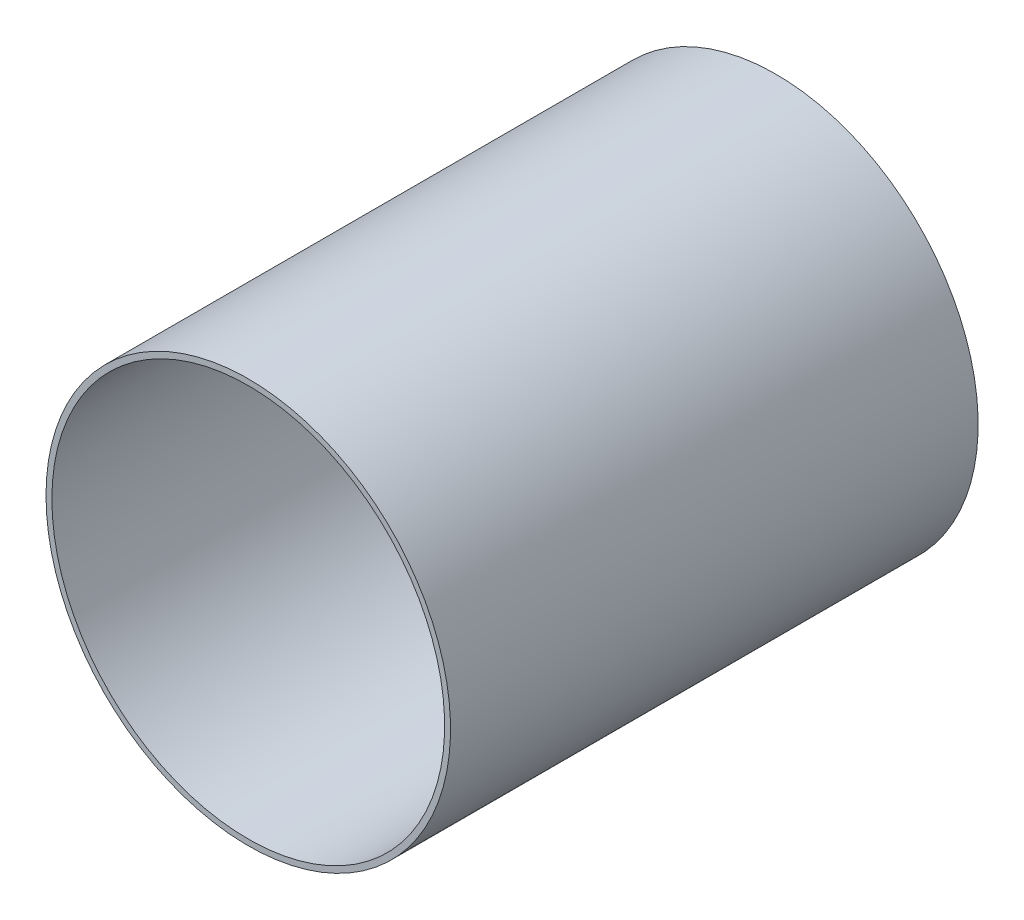
ISO-10303-21;
HEADER;
FILE_DESCRIPTION(('STEP AP214'),'2;1');
FILE_NAME('part.step','',(''),(''),'','','');
FILE_SCHEMA(('AUTOMOTIVE_DESIGN { 1 0 10303 214 1 1 1 1 }'));
ENDSEC;
DATA;
#1=APPLICATION_CONTEXT('core data for automotive mechanical design processes');
#2=APPLICATION_PROTOCOL_DEFINITION('international standard','automotive_design',2000,#1);
#3=PRODUCT_CONTEXT('',#1,'mechanical');
#4=PRODUCT('Part','Part','',(#3));
#5=PRODUCT_RELATED_PRODUCT_CATEGORY('part','',(#4));
#6=PRODUCT_DEFINITION_FORMATION('','',#4);
#7=PRODUCT_DEFINITION_CONTEXT('part definition',#1,'design');
#8=PRODUCT_DEFINITION('design','',#6,#7);
#9=PRODUCT_DEFINITION_SHAPE('','',#8);
#10=(LENGTH_UNIT() NAMED_UNIT(*) SI_UNIT(.MILLI.,.METRE.));
#11=(NAMED_UNIT(*) PLANE_ANGLE_UNIT() SI_UNIT($,.RADIAN.));
#12=(NAMED_UNIT(*) SI_UNIT($,.STERADIAN.) SOLID_ANGLE_UNIT());
#13=UNCERTAINTY_MEASURE_WITH_UNIT(LENGTH_MEASURE(1.E-05),#10,'distance_accuracy_value','');
#14=(GEOMETRIC_REPRESENTATION_CONTEXT(3) GLOBAL_UNCERTAINTY_ASSIGNED_CONTEXT((#13)) GLOBAL_UNIT_ASSIGNED_CONTEXT((#10,
#11,#12)) REPRESENTATION_CONTEXT('',''));
#15=CARTESIAN_POINT('',(0.,0.,0.));
#16=DIRECTION('',(0.,0.,1.));
#17=DIRECTION('',(1.,0.,0.));
#18=AXIS2_PLACEMENT_3D('',#15,#16,#17);
#19=CARTESIAN_POINT('',(0.,0.,90.));
#20=DIRECTION('',(0.,0.,1.));
#21=DIRECTION('',(1.,0.,0.));
#22=AXIS2_PLACEMENT_3D('',#19,#20,#21);
#23=PLANE('',#22);
#24=CARTESIAN_POINT('',(0.,0.,90.));
#25=DIRECTION('',(0.,0.,1.));
#26=DIRECTION('',(1.,0.,0.));
#27=AXIS2_PLACEMENT_3D('',#24,#25,#26);
#28=CIRCLE('',#27,34.5);
#29=CARTESIAN_POINT('',(-34.5,0.,90.));
#30=VERTEX_POINT('',#29);
#31=EDGE_CURVE('E11',#30,#30,#28,.T.);
#32=ORIENTED_EDGE('',*,*,#31,.T.);
#33=EDGE_LOOP('',(#32));
#34=FACE_BOUND('',#33,.T.);
#35=CARTESIAN_POINT('',(0.,0.,90.));
#36=DIRECTION('',(0.,0.,1.));
#37=DIRECTION('',(1.,0.,0.));
#38=AXIS2_PLACEMENT_3D('',#35,#36,#37);
#39=CIRCLE('',#38,33.5);
#40=CARTESIAN_POINT('',(-33.5,0.,90.));
#41=VERTEX_POINT('',#40);
#42=EDGE_CURVE('E54',#41,#41,#39,.T.);
#43=ORIENTED_EDGE('',*,*,#42,.F.);
#44=EDGE_LOOP('',(#43));
#45=FACE_BOUND('',#44,.T.);
#46=ADVANCED_FACE('F43',(#34,#45),#23,.T.);
#47=CARTESIAN_POINT('',(0.,0.,0.));
#48=DIRECTION('',(0.,0.,1.));
#49=DIRECTION('',(1.,0.,0.));
#50=AXIS2_PLACEMENT_3D('',#47,#48,#49);
#51=PLANE('',#50);
#52=CARTESIAN_POINT('',(0.,0.,0.));
#53=DIRECTION('',(0.,0.,1.));
#54=DIRECTION('',(1.,0.,0.));
#55=AXIS2_PLACEMENT_3D('',#52,#53,#54);
#56=CIRCLE('',#55,34.5);
#57=CARTESIAN_POINT('',(-34.5,0.,0.));
#58=VERTEX_POINT('',#57);
#59=EDGE_CURVE('E47',#58,#58,#56,.T.);
#60=ORIENTED_EDGE('',*,*,#59,.F.);
#61=EDGE_LOOP('',(#60));
#62=FACE_BOUND('',#61,.T.);
#63=CARTESIAN_POINT('',(0.,0.,0.));
#64=DIRECTION('',(0.,0.,1.));
#65=DIRECTION('',(1.,0.,0.));
#66=AXIS2_PLACEMENT_3D('',#63,#64,#65);
#67=CIRCLE('',#66,33.5);
#68=CARTESIAN_POINT('',(-33.5,0.,0.));
#69=VERTEX_POINT('',#68);
#70=EDGE_CURVE('E56',#69,#69,#67,.T.);
#71=ORIENTED_EDGE('',*,*,#70,.T.);
#72=EDGE_LOOP('',(#71));
#73=FACE_BOUND('',#72,.T.);
#74=ADVANCED_FACE('F66',(#62,#73),#51,.F.);
#75=CARTESIAN_POINT('',(0.,0.,90.));
#76=DIRECTION('',(0.,0.,-1.));
#77=DIRECTION('',(-1.,0.,0.));
#78=AXIS2_PLACEMENT_3D('',#75,#76,#77);
#79=CYLINDRICAL_SURFACE('',#78,34.5);
#80=CARTESIAN_POINT('',(-34.5,0.,90.));
#81=CARTESIAN_POINT('',(-34.5,0.,89.0625));
#82=CARTESIAN_POINT('',(-34.5,0.,88.125));
#83=CARTESIAN_POINT('',(-34.5,0.,86.25));
#84=CARTESIAN_POINT('',(-34.5,0.,85.3125));
#85=CARTESIAN_POINT('',(-34.5,0.,83.4375));
#86=CARTESIAN_POINT('',(-34.5,0.,82.5));
#87=CARTESIAN_POINT('',(-34.5,0.,80.625));
#88=CARTESIAN_POINT('',(-34.5,0.,79.6875));
#89=CARTESIAN_POINT('',(-34.5,0.,77.8125));
#90=CARTESIAN_POINT('',(-34.5,0.,76.875));
#91=CARTESIAN_POINT('',(-34.5,0.,75.));
#92=CARTESIAN_POINT('',(-34.5,0.,74.0625));
#93=CARTESIAN_POINT('',(-34.5,0.,72.1875));
#94=CARTESIAN_POINT('',(-34.5,0.,71.25));
#95=CARTESIAN_POINT('',(-34.5,0.,69.375));
#96=CARTESIAN_POINT('',(-34.5,0.,68.4375));
#97=CARTESIAN_POINT('',(-34.5,0.,66.5625));
#98=CARTESIAN_POINT('',(-34.5,0.,65.625));
#99=CARTESIAN_POINT('',(-34.5,0.,63.75));
#100=CARTESIAN_POINT('',(-34.5,0.,62.8125));
#101=CARTESIAN_POINT('',(-34.5,0.,60.9375));
#102=CARTESIAN_POINT('',(-34.5,0.,60.));
#103=CARTESIAN_POINT('',(-34.5,0.,58.125));
#104=CARTESIAN_POINT('',(-34.5,0.,57.1875));
#105=CARTESIAN_POINT('',(-34.5,0.,55.3125));
#106=CARTESIAN_POINT('',(-34.5,0.,54.375));
#107=CARTESIAN_POINT('',(-34.5,0.,52.5));
#108=CARTESIAN_POINT('',(-34.5,0.,51.5625));
#109=CARTESIAN_POINT('',(-34.5,0.,49.6875));
#110=CARTESIAN_POINT('',(-34.5,0.,48.75));
#111=CARTESIAN_POINT('',(-34.5,0.,46.875));
#112=CARTESIAN_POINT('',(-34.5,0.,45.9375));
#113=CARTESIAN_POINT('',(-34.5,0.,44.0625));
#114=CARTESIAN_POINT('',(-34.5,0.,43.125));
#115=CARTESIAN_POINT('',(-34.5,0.,41.25));
#116=CARTESIAN_POINT('',(-34.5,0.,40.3125));
#117=CARTESIAN_POINT('',(-34.5,0.,38.4375));
#118=CARTESIAN_POINT('',(-34.5,0.,37.5));
#119=CARTESIAN_POINT('',(-34.5,0.,35.625));
#120=CARTESIAN_POINT('',(-34.5,0.,34.6875));
#121=CARTESIAN_POINT('',(-34.5,0.,32.8125));
#122=CARTESIAN_POINT('',(-34.5,0.,31.875));
#123=CARTESIAN_POINT('',(-34.5,0.,30.));
#124=CARTESIAN_POINT('',(-34.5,0.,29.0625));
#125=CARTESIAN_POINT('',(-34.5,0.,27.1875));
#126=CARTESIAN_POINT('',(-34.5,0.,26.25));
#127=CARTESIAN_POINT('',(-34.5,0.,24.375));
#128=CARTESIAN_POINT('',(-34.5,0.,23.4375));
#129=CARTESIAN_POINT('',(-34.5,0.,21.5625));
#130=CARTESIAN_POINT('',(-34.5,0.,20.625));
#131=CARTESIAN_POINT('',(-34.5,0.,18.75));
#132=CARTESIAN_POINT('',(-34.5,0.,17.8125));
#133=CARTESIAN_POINT('',(-34.5,0.,15.9375));
#134=CARTESIAN_POINT('',(-34.5,0.,15.));
#135=CARTESIAN_POINT('',(-34.5,0.,13.125));
#136=CARTESIAN_POINT('',(-34.5,0.,12.1875));
#137=CARTESIAN_POINT('',(-34.5,0.,10.3125));
#138=CARTESIAN_POINT('',(-34.5,0.,9.37499999999999));
#139=CARTESIAN_POINT('',(-34.5,0.,7.49999999999999));
#140=CARTESIAN_POINT('',(-34.5,0.,6.56249999999999));
#141=CARTESIAN_POINT('',(-34.5,0.,4.68749999999999));
#142=CARTESIAN_POINT('',(-34.5,0.,3.74999999999998));
#143=CARTESIAN_POINT('',(-34.5,0.,1.87499999999998));
#144=CARTESIAN_POINT('',(-34.5,0.,0.937499999999986));
#145=CARTESIAN_POINT('',(-34.5,0.,0.));
#146=B_SPLINE_CURVE_WITH_KNOTS('',3,(#80,#81,#82,#83,#84,#85,#86,#87,#88,#89,#90,#91,#92,#93,
#94,#95,#96,#97,#98,#99,#100,#101,#102,#103,#104,#105,#106,#107,#108,#109,#110,#111,#112,#113,
#114,#115,#116,#117,#118,#119,#120,#121,#122,#123,#124,#125,#126,#127,#128,#129,#130,#131,#132,
#133,#134,#135,#136,#137,#138,#139,#140,#141,#142,#143,#144,#145),.UNSPECIFIED.,.F.,.F.,(4,2,2,
2,2,2,2,2,2,2,2,2,2,2,2,2,2,2,2,2,2,2,2,2,2,2,2,2,2,2,2,2,4),(0.,2.81250000000001,
5.62500000000001,8.43750000000001,11.25,14.0625,16.875,19.6875,22.5,25.3125,28.125,30.9375,
33.75,36.5625,39.375,42.1875,45.,47.8125,50.625,53.4375,56.25,59.0625,61.875,64.6875,67.5,
70.3125,73.125,75.9375,78.75,81.5625,84.375,87.1875,90.),.UNSPECIFIED.);
#147=EDGE_CURVE('BSEAM45',#30,#58,#146,.T.);
#148=ORIENTED_EDGE('',*,*,#31,.F.);
#149=ORIENTED_EDGE('',*,*,#59,.T.);
#150=ORIENTED_EDGE('',*,*,#147,.T.);
#151=ORIENTED_EDGE('',*,*,#147,.F.);
#152=EDGE_LOOP('',(#148,#150,#149,#151));
#153=FACE_BOUND('',#152,.T.);
#154=ADVANCED_FACE('F45',(#153),#79,.T.);
#155=CARTESIAN_POINT('',(0.,0.,90.));
#156=DIRECTION('',(0.,0.,-1.));
#157=DIRECTION('',(-1.,0.,0.));
#158=AXIS2_PLACEMENT_3D('',#155,#156,#157);
#159=CYLINDRICAL_SURFACE('',#158,33.5);
#160=CARTESIAN_POINT('',(-33.5,0.,90.));
#161=CARTESIAN_POINT('',(-33.5,0.,89.0625));
#162=CARTESIAN_POINT('',(-33.5,0.,88.125));
#163=CARTESIAN_POINT('',(-33.5,0.,86.25));
#164=CARTESIAN_POINT('',(-33.5,0.,85.3125));
#165=CARTESIAN_POINT('',(-33.5,0.,83.4375));
#166=CARTESIAN_POINT('',(-33.5,0.,82.5));
#167=CARTESIAN_POINT('',(-33.5,0.,80.625));
#168=CARTESIAN_POINT('',(-33.5,0.,79.6875));
#169=CARTESIAN_POINT('',(-33.5,0.,77.8125));
#170=CARTESIAN_POINT('',(-33.5,0.,76.875));
#171=CARTESIAN_POINT('',(-33.5,0.,75.));
#172=CARTESIAN_POINT('',(-33.5,0.,74.0625));
#173=CARTESIAN_POINT('',(-33.5,0.,72.1875));
#174=CARTESIAN_POINT('',(-33.5,0.,71.25));
#175=CARTESIAN_POINT('',(-33.5,0.,69.375));
#176=CARTESIAN_POINT('',(-33.5,0.,68.4375));
#177=CARTESIAN_POINT('',(-33.5,0.,66.5625));
#178=CARTESIAN_POINT('',(-33.5,0.,65.625));
#179=CARTESIAN_POINT('',(-33.5,0.,63.75));
#180=CARTESIAN_POINT('',(-33.5,0.,62.8125));
#181=CARTESIAN_POINT('',(-33.5,0.,60.9375));
#182=CARTESIAN_POINT('',(-33.5,0.,60.));
#183=CARTESIAN_POINT('',(-33.5,0.,58.125));
#184=CARTESIAN_POINT('',(-33.5,0.,57.1875));
#185=CARTESIAN_POINT('',(-33.5,0.,55.3125));
#186=CARTESIAN_POINT('',(-33.5,0.,54.375));
#187=CARTESIAN_POINT('',(-33.5,0.,52.5));
#188=CARTESIAN_POINT('',(-33.5,0.,51.5625));
#189=CARTESIAN_POINT('',(-33.5,0.,49.6875));
#190=CARTESIAN_POINT('',(-33.5,0.,48.75));
#191=CARTESIAN_POINT('',(-33.5,0.,46.875));
#192=CARTESIAN_POINT('',(-33.5,0.,45.9375));
#193=CARTESIAN_POINT('',(-33.5,0.,44.0625));
#194=CARTESIAN_POINT('',(-33.5,0.,43.125));
#195=CARTESIAN_POINT('',(-33.5,0.,41.25));
#196=CARTESIAN_POINT('',(-33.5,0.,40.3125));
#197=CARTESIAN_POINT('',(-33.5,0.,38.4375));
#198=CARTESIAN_POINT('',(-33.5,0.,37.5));
#199=CARTESIAN_POINT('',(-33.5,0.,35.625));
#200=CARTESIAN_POINT('',(-33.5,0.,34.6875));
#201=CARTESIAN_POINT('',(-33.5,0.,32.8125));
#202=CARTESIAN_POINT('',(-33.5,0.,31.875));
#203=CARTESIAN_POINT('',(-33.5,0.,30.));
#204=CARTESIAN_POINT('',(-33.5,0.,29.0625));
#205=CARTESIAN_POINT('',(-33.5,0.,27.1875));
#206=CARTESIAN_POINT('',(-33.5,0.,26.25));
#207=CARTESIAN_POINT('',(-33.5,0.,24.375));
#208=CARTESIAN_POINT('',(-33.5,0.,23.4375));
#209=CARTESIAN_POINT('',(-33.5,0.,21.5625));
#210=CARTESIAN_POINT('',(-33.5,0.,20.625));
#211=CARTESIAN_POINT('',(-33.5,0.,18.75));
#212=CARTESIAN_POINT('',(-33.5,0.,17.8125));
#213=CARTESIAN_POINT('',(-33.5,0.,15.9375));
#214=CARTESIAN_POINT('',(-33.5,0.,15.));
#215=CARTESIAN_POINT('',(-33.5,0.,13.125));
#216=CARTESIAN_POINT('',(-33.5,0.,12.1875));
#217=CARTESIAN_POINT('',(-33.5,0.,10.3125));
#218=CARTESIAN_POINT('',(-33.5,0.,9.37499999999999));
#219=CARTESIAN_POINT('',(-33.5,0.,7.49999999999999));
#220=CARTESIAN_POINT('',(-33.5,0.,6.56249999999999));
#221=CARTESIAN_POINT('',(-33.5,0.,4.68749999999999));
#222=CARTESIAN_POINT('',(-33.5,0.,3.74999999999998));
#223=CARTESIAN_POINT('',(-33.5,0.,1.87499999999998));
#224=CARTESIAN_POINT('',(-33.5,0.,0.937499999999986));
#225=CARTESIAN_POINT('',(-33.5,0.,0.));
#226=B_SPLINE_CURVE_WITH_KNOTS('',3,(#160,#161,#162,#163,#164,#165,#166,#167,#168,#169,#170,
#171,#172,#173,#174,#175,#176,#177,#178,#179,#180,#181,#182,#183,#184,#185,#186,#187,#188,#189,
#190,#191,#192,#193,#194,#195,#196,#197,#198,#199,#200,#201,#202,#203,#204,#205,#206,#207,#208,
#209,#210,#211,#212,#213,#214,#215,#216,#217,#218,#219,#220,#221,#222,#223,#224,#225),
.UNSPECIFIED.,.F.,.F.,(4,2,2,2,2,2,2,2,2,2,2,2,2,2,2,2,2,2,2,2,2,2,2,2,2,2,2,2,2,2,2,2,4),(0.,
2.8125,5.62499999999999,8.43749999999999,11.25,14.0625,16.875,19.6875,22.5,25.3125,28.125,
30.9375,33.75,36.5625,39.375,42.1875,45.,47.8125,50.625,53.4375,56.25,59.0625,61.875,64.6875,
67.5,70.3125,73.125,75.9375,78.75,81.5625,84.375,87.1875,90.),.UNSPECIFIED.);
#227=EDGE_CURVE('BSEAM62',#41,#69,#226,.T.);
#228=ORIENTED_EDGE('',*,*,#42,.T.);
#229=ORIENTED_EDGE('',*,*,#70,.F.);
#230=ORIENTED_EDGE('',*,*,#227,.T.);
#231=ORIENTED_EDGE('',*,*,#227,.F.);
#232=EDGE_LOOP('',(#228,#230,#229,#231));
#233=FACE_BOUND('',#232,.T.);
#234=ADVANCED_FACE('F62',(#233),#159,.F.);
#235=CLOSED_SHELL('',(#46,#74,#154,#234));
#236=MANIFOLD_SOLID_BREP('B2',#235);
#237=ADVANCED_BREP_SHAPE_REPRESENTATION('',(#18,#236),#14);
#238=SHAPE_DEFINITION_REPRESENTATION(#9,#237);
ENDSEC;
END-ISO-10303-21;
